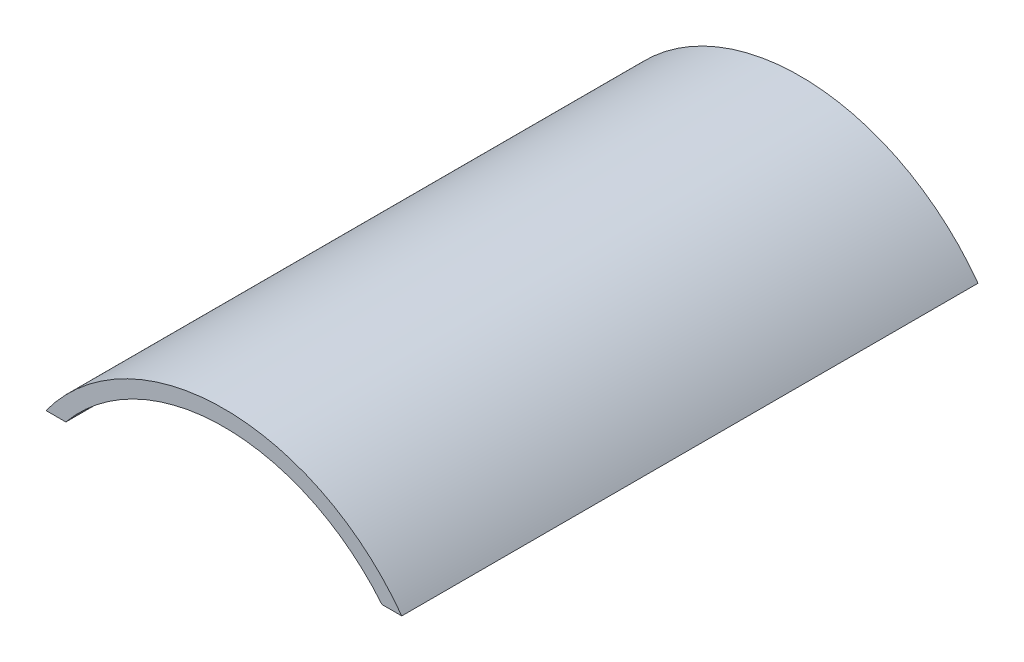
ISO-10303-21;
HEADER;
FILE_DESCRIPTION(('STEP AP214'),'2;1');
FILE_NAME('part.step','',(''),(''),'','','');
FILE_SCHEMA(('AUTOMOTIVE_DESIGN { 1 0 10303 214 1 1 1 1 }'));
ENDSEC;
DATA;
#1=APPLICATION_CONTEXT('core data for automotive mechanical design processes');
#2=APPLICATION_PROTOCOL_DEFINITION('international standard','automotive_design',2000,#1);
#3=PRODUCT_CONTEXT('',#1,'mechanical');
#4=PRODUCT('Part','Part','',(#3));
#5=PRODUCT_RELATED_PRODUCT_CATEGORY('part','',(#4));
#6=PRODUCT_DEFINITION_FORMATION('','',#4);
#7=PRODUCT_DEFINITION_CONTEXT('part definition',#1,'design');
#8=PRODUCT_DEFINITION('design','',#6,#7);
#9=PRODUCT_DEFINITION_SHAPE('','',#8);
#10=(LENGTH_UNIT() NAMED_UNIT(*) SI_UNIT(.MILLI.,.METRE.));
#11=(NAMED_UNIT(*) PLANE_ANGLE_UNIT() SI_UNIT($,.RADIAN.));
#12=(NAMED_UNIT(*) SI_UNIT($,.STERADIAN.) SOLID_ANGLE_UNIT());
#13=UNCERTAINTY_MEASURE_WITH_UNIT(LENGTH_MEASURE(1.E-05),#10,'distance_accuracy_value','');
#14=(GEOMETRIC_REPRESENTATION_CONTEXT(3) GLOBAL_UNCERTAINTY_ASSIGNED_CONTEXT((#13)) GLOBAL_UNIT_ASSIGNED_CONTEXT((#10,
#11,#12)) REPRESENTATION_CONTEXT('',''));
#15=CARTESIAN_POINT('',(0.,0.,0.));
#16=DIRECTION('',(0.,0.,1.));
#17=DIRECTION('',(1.,0.,0.));
#18=AXIS2_PLACEMENT_3D('',#15,#16,#17);
#19=CARTESIAN_POINT('',(15.0838840125447,12.3582540472389,55.));
#20=DIRECTION('',(0.,1.,0.));
#21=DIRECTION('',(0.,0.,1.));
#22=AXIS2_PLACEMENT_3D('',#19,#20,#21);
#23=PLANE('',#22);
#24=DIRECTION('',(1.,0.,0.));
#25=VECTOR('',#24,1.);
#26=CARTESIAN_POINT('',(15.0838840125447,12.3582540472389,0.));
#27=LINE('',#26,#25);
#28=CARTESIAN_POINT('',(15.0838840125447,12.3582540472389,0.));
#29=VERTEX_POINT('',#28);
#30=CARTESIAN_POINT('',(16.9786205830716,12.3582540472389,0.));
#31=VERTEX_POINT('',#30);
#32=EDGE_CURVE('E109',#29,#31,#27,.T.);
#33=ORIENTED_EDGE('',*,*,#32,.T.);
#34=DIRECTION('',(0.,0.,-1.));
#35=VECTOR('',#34,1.);
#36=CARTESIAN_POINT('',(16.9786205830716,12.3582540472389,55.));
#37=LINE('',#36,#35);
#38=CARTESIAN_POINT('',(16.9786205830716,12.3582540472389,55.));
#39=VERTEX_POINT('',#38);
#40=EDGE_CURVE('E11',#39,#31,#37,.T.);
#41=ORIENTED_EDGE('',*,*,#40,.F.);
#42=DIRECTION('',(1.,0.,0.));
#43=VECTOR('',#42,1.);
#44=CARTESIAN_POINT('',(15.0838840125447,12.3582540472389,55.));
#45=LINE('',#44,#43);
#46=CARTESIAN_POINT('',(15.0838840125447,12.3582540472389,55.));
#47=VERTEX_POINT('',#46);
#48=EDGE_CURVE('E91',#47,#39,#45,.T.);
#49=ORIENTED_EDGE('',*,*,#48,.F.);
#50=DIRECTION('',(0.,0.,-1.));
#51=VECTOR('',#50,1.);
#52=CARTESIAN_POINT('',(15.0838840125447,12.3582540472389,55.));
#53=LINE('',#52,#51);
#54=EDGE_CURVE('E58',#47,#29,#53,.T.);
#55=ORIENTED_EDGE('',*,*,#54,.T.);
#56=EDGE_LOOP('',(#33,#41,#49,#55));
#57=FACE_BOUND('',#56,.T.);
#58=ADVANCED_FACE('F41',(#57),#23,.F.);
#59=CARTESIAN_POINT('',(0.,0.,55.));
#60=DIRECTION('',(0.,0.,-1.));
#61=DIRECTION('',(-1.,0.,0.));
#62=AXIS2_PLACEMENT_3D('',#59,#60,#61);
#63=CYLINDRICAL_SURFACE('',#62,21.);
#64=CARTESIAN_POINT('',(0.,0.,0.));
#65=DIRECTION('',(0.,0.,1.));
#66=DIRECTION('',(1.,0.,0.));
#67=AXIS2_PLACEMENT_3D('',#64,#65,#66);
#68=CIRCLE('',#67,21.);
#69=CARTESIAN_POINT('',(-16.9786205830716,12.3582540472389,0.));
#70=VERTEX_POINT('',#69);
#71=EDGE_CURVE('E97',#31,#70,#68,.T.);
#72=ORIENTED_EDGE('',*,*,#71,.T.);
#73=DIRECTION('',(0.,0.,-1.));
#74=VECTOR('',#73,1.);
#75=CARTESIAN_POINT('',(-16.9786205830716,12.3582540472389,55.));
#76=LINE('',#75,#74);
#77=CARTESIAN_POINT('',(-16.9786205830716,12.3582540472389,55.));
#78=VERTEX_POINT('',#77);
#79=EDGE_CURVE('E50',#78,#70,#76,.T.);
#80=ORIENTED_EDGE('',*,*,#79,.F.);
#81=CARTESIAN_POINT('',(0.,0.,55.));
#82=DIRECTION('',(0.,0.,1.));
#83=DIRECTION('',(1.,0.,0.));
#84=AXIS2_PLACEMENT_3D('',#81,#82,#83);
#85=CIRCLE('',#84,21.);
#86=EDGE_CURVE('E83',#39,#78,#85,.T.);
#87=ORIENTED_EDGE('',*,*,#86,.F.);
#88=ORIENTED_EDGE('',*,*,#40,.T.);
#89=EDGE_LOOP('',(#72,#80,#87,#88));
#90=FACE_BOUND('',#89,.T.);
#91=ADVANCED_FACE('F96',(#90),#63,.T.);
#92=CARTESIAN_POINT('',(-15.0838840125447,12.3582540472389,55.));
#93=DIRECTION('',(0.,-1.,0.));
#94=DIRECTION('',(0.,0.,-1.));
#95=AXIS2_PLACEMENT_3D('',#92,#93,#94);
#96=PLANE('',#95);
#97=DIRECTION('',(-1.,0.,0.));
#98=VECTOR('',#97,1.);
#99=CARTESIAN_POINT('',(-15.0838840125447,12.3582540472389,0.));
#100=LINE('',#99,#98);
#101=CARTESIAN_POINT('',(-15.0838840125447,12.3582540472389,0.));
#102=VERTEX_POINT('',#101);
#103=EDGE_CURVE('E114',#102,#70,#100,.T.);
#104=ORIENTED_EDGE('',*,*,#103,.F.);
#105=DIRECTION('',(0.,0.,-1.));
#106=VECTOR('',#105,1.);
#107=CARTESIAN_POINT('',(-15.0838840125447,12.3582540472389,55.));
#108=LINE('',#107,#106);
#109=CARTESIAN_POINT('',(-15.0838840125447,12.3582540472389,55.));
#110=VERTEX_POINT('',#109);
#111=EDGE_CURVE('E72',#110,#102,#108,.T.);
#112=ORIENTED_EDGE('',*,*,#111,.F.);
#113=DIRECTION('',(-1.,0.,0.));
#114=VECTOR('',#113,1.);
#115=CARTESIAN_POINT('',(-15.0838840125447,12.3582540472389,55.));
#116=LINE('',#115,#114);
#117=EDGE_CURVE('E90',#110,#78,#116,.T.);
#118=ORIENTED_EDGE('',*,*,#117,.T.);
#119=ORIENTED_EDGE('',*,*,#79,.T.);
#120=EDGE_LOOP('',(#104,#112,#118,#119));
#121=FACE_BOUND('',#120,.T.);
#122=ADVANCED_FACE('F101',(#121),#96,.T.);
#123=CARTESIAN_POINT('',(0.,0.,55.));
#124=DIRECTION('',(0.,0.,-1.));
#125=DIRECTION('',(-1.,0.,0.));
#126=AXIS2_PLACEMENT_3D('',#123,#124,#125);
#127=CYLINDRICAL_SURFACE('',#126,19.5);
#128=CARTESIAN_POINT('',(0.,0.,0.));
#129=DIRECTION('',(0.,0.,1.));
#130=DIRECTION('',(1.,0.,0.));
#131=AXIS2_PLACEMENT_3D('',#128,#129,#130);
#132=CIRCLE('',#131,19.5);
#133=EDGE_CURVE('E117',#29,#102,#132,.T.);
#134=ORIENTED_EDGE('',*,*,#133,.F.);
#135=ORIENTED_EDGE('',*,*,#54,.F.);
#136=CARTESIAN_POINT('',(0.,0.,55.));
#137=DIRECTION('',(0.,0.,1.));
#138=DIRECTION('',(1.,0.,0.));
#139=AXIS2_PLACEMENT_3D('',#136,#137,#138);
#140=CIRCLE('',#139,19.5);
#141=EDGE_CURVE('E103',#47,#110,#140,.T.);
#142=ORIENTED_EDGE('',*,*,#141,.T.);
#143=ORIENTED_EDGE('',*,*,#111,.T.);
#144=EDGE_LOOP('',(#134,#135,#142,#143));
#145=FACE_BOUND('',#144,.T.);
#146=ADVANCED_FACE('F127',(#145),#127,.F.);
#147=CARTESIAN_POINT('',(0.,0.,55.));
#148=DIRECTION('',(0.,0.,1.));
#149=DIRECTION('',(1.,0.,0.));
#150=AXIS2_PLACEMENT_3D('',#147,#148,#149);
#151=PLANE('',#150);
#152=ORIENTED_EDGE('',*,*,#48,.T.);
#153=ORIENTED_EDGE('',*,*,#86,.T.);
#154=ORIENTED_EDGE('',*,*,#117,.F.);
#155=ORIENTED_EDGE('',*,*,#141,.F.);
#156=EDGE_LOOP('',(#152,#153,#154,#155));
#157=FACE_BOUND('',#156,.T.);
#158=ADVANCED_FACE('F87',(#157),#151,.T.);
#159=CARTESIAN_POINT('',(0.,0.,0.));
#160=DIRECTION('',(0.,0.,1.));
#161=DIRECTION('',(1.,0.,0.));
#162=AXIS2_PLACEMENT_3D('',#159,#160,#161);
#163=PLANE('',#162);
#164=ORIENTED_EDGE('',*,*,#32,.F.);
#165=ORIENTED_EDGE('',*,*,#133,.T.);
#166=ORIENTED_EDGE('',*,*,#103,.T.);
#167=ORIENTED_EDGE('',*,*,#71,.F.);
#168=EDGE_LOOP('',(#164,#165,#166,#167));
#169=FACE_BOUND('',#168,.T.);
#170=ADVANCED_FACE('F126',(#169),#163,.F.);
#171=CLOSED_SHELL('',(#58,#91,#122,#146,#158,#170));
#172=MANIFOLD_SOLID_BREP('B2',#171);
#173=ADVANCED_BREP_SHAPE_REPRESENTATION('',(#18,#172),#14);
#174=SHAPE_DEFINITION_REPRESENTATION(#9,#173);
ENDSEC;
END-ISO-10303-21;
